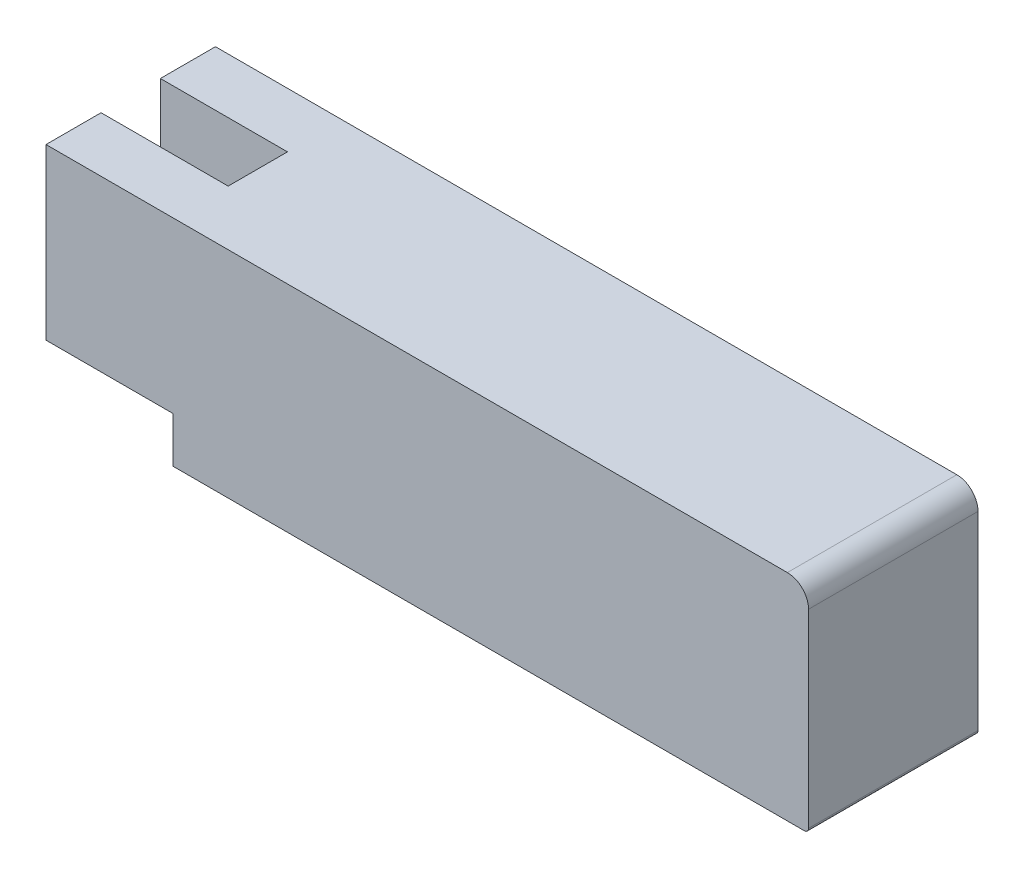
ISO-10303-21;
HEADER;
FILE_DESCRIPTION(('STEP AP214'),'2;1');
FILE_NAME('part.step','',(''),(''),'','','');
FILE_SCHEMA(('AUTOMOTIVE_DESIGN { 1 0 10303 214 1 1 1 1 }'));
ENDSEC;
DATA;
#1=APPLICATION_CONTEXT('core data for automotive mechanical design processes');
#2=APPLICATION_PROTOCOL_DEFINITION('international standard','automotive_design',2000,#1);
#3=PRODUCT_CONTEXT('',#1,'mechanical');
#4=PRODUCT('Part','Part','',(#3));
#5=PRODUCT_RELATED_PRODUCT_CATEGORY('part','',(#4));
#6=PRODUCT_DEFINITION_FORMATION('','',#4);
#7=PRODUCT_DEFINITION_CONTEXT('part definition',#1,'design');
#8=PRODUCT_DEFINITION('design','',#6,#7);
#9=PRODUCT_DEFINITION_SHAPE('','',#8);
#10=(LENGTH_UNIT() NAMED_UNIT(*) SI_UNIT(.MILLI.,.METRE.));
#11=(NAMED_UNIT(*) PLANE_ANGLE_UNIT() SI_UNIT($,.RADIAN.));
#12=(NAMED_UNIT(*) SI_UNIT($,.STERADIAN.) SOLID_ANGLE_UNIT());
#13=UNCERTAINTY_MEASURE_WITH_UNIT(LENGTH_MEASURE(1.E-05),#10,'distance_accuracy_value','');
#14=(GEOMETRIC_REPRESENTATION_CONTEXT(3) GLOBAL_UNCERTAINTY_ASSIGNED_CONTEXT((#13)) GLOBAL_UNIT_ASSIGNED_CONTEXT((#10,
#11,#12)) REPRESENTATION_CONTEXT('',''));
#15=CARTESIAN_POINT('',(0.,0.,0.));
#16=DIRECTION('',(0.,0.,1.));
#17=DIRECTION('',(1.,0.,0.));
#18=AXIS2_PLACEMENT_3D('',#15,#16,#17);
#19=CARTESIAN_POINT('',(0.,0.,20.));
#20=DIRECTION('',(1.,0.,0.));
#21=DIRECTION('',(0.,1.,0.));
#22=AXIS2_PLACEMENT_3D('',#19,#20,#21);
#23=PLANE('',#22);
#24=DIRECTION('',(0.,-1.,0.));
#25=VECTOR('',#24,1.);
#26=CARTESIAN_POINT('',(0.,0.,-7.));
#27=LINE('',#26,#25);
#28=CARTESIAN_POINT('',(0.,0.,-7.));
#29=VERTEX_POINT('',#28);
#30=CARTESIAN_POINT('',(0.,-40.,-7.));
#31=VERTEX_POINT('',#30);
#32=EDGE_CURVE('E122',#29,#31,#27,.T.);
#33=ORIENTED_EDGE('',*,*,#32,.F.);
#34=DIRECTION('',(0.,0.,-1.));
#35=VECTOR('',#34,1.);
#36=CARTESIAN_POINT('',(0.,0.,20.));
#37=LINE('',#36,#35);
#38=CARTESIAN_POINT('',(0.,0.,-20.));
#39=VERTEX_POINT('',#38);
#40=EDGE_CURVE('E191',#29,#39,#37,.T.);
#41=ORIENTED_EDGE('',*,*,#40,.T.);
#42=DIRECTION('',(0.,-1.,0.));
#43=VECTOR('',#42,1.);
#44=CARTESIAN_POINT('',(0.,0.,-20.));
#45=LINE('',#44,#43);
#46=CARTESIAN_POINT('',(0.,-40.,-20.));
#47=VERTEX_POINT('',#46);
#48=EDGE_CURVE('E145',#39,#47,#45,.T.);
#49=ORIENTED_EDGE('',*,*,#48,.T.);
#50=DIRECTION('',(0.,0.,-1.));
#51=VECTOR('',#50,1.);
#52=CARTESIAN_POINT('',(0.,-40.,20.));
#53=LINE('',#52,#51);
#54=EDGE_CURVE('E138',#31,#47,#53,.T.);
#55=ORIENTED_EDGE('',*,*,#54,.F.);
#56=EDGE_LOOP('',(#33,#41,#49,#55));
#57=FACE_BOUND('',#56,.T.);
#58=ADVANCED_FACE('F33',(#57),#23,.F.);
#59=CARTESIAN_POINT('',(0.,-40.,20.));
#60=DIRECTION('',(0.,1.,0.));
#61=DIRECTION('',(0.,0.,1.));
#62=AXIS2_PLACEMENT_3D('',#59,#60,#61);
#63=PLANE('',#62);
#64=DIRECTION('',(1.,0.,0.));
#65=VECTOR('',#64,1.);
#66=CARTESIAN_POINT('',(0.,-40.,-7.));
#67=LINE('',#66,#65);
#68=CARTESIAN_POINT('',(30.,-40.,-7.));
#69=VERTEX_POINT('',#68);
#70=EDGE_CURVE('E126',#31,#69,#67,.T.);
#71=ORIENTED_EDGE('',*,*,#70,.F.);
#72=ORIENTED_EDGE('',*,*,#54,.T.);
#73=DIRECTION('',(1.,0.,0.));
#74=VECTOR('',#73,1.);
#75=CARTESIAN_POINT('',(0.,-40.,-20.));
#76=LINE('',#75,#74);
#77=CARTESIAN_POINT('',(30.,-40.,-20.));
#78=VERTEX_POINT('',#77);
#79=EDGE_CURVE('E197',#47,#78,#76,.T.);
#80=ORIENTED_EDGE('',*,*,#79,.T.);
#81=DIRECTION('',(0.,0.,-1.));
#82=VECTOR('',#81,1.);
#83=CARTESIAN_POINT('',(30.,-40.,20.));
#84=LINE('',#83,#82);
#85=EDGE_CURVE('E140',#69,#78,#84,.T.);
#86=ORIENTED_EDGE('',*,*,#85,.F.);
#87=EDGE_LOOP('',(#71,#72,#80,#86));
#88=FACE_BOUND('',#87,.T.);
#89=ADVANCED_FACE('F136',(#88),#63,.F.);
#90=CARTESIAN_POINT('',(0.,0.,20.));
#91=DIRECTION('',(0.,1.,0.));
#92=DIRECTION('',(0.,0.,1.));
#93=AXIS2_PLACEMENT_3D('',#90,#91,#92);
#94=PLANE('',#93);
#95=DIRECTION('',(1.,0.,0.));
#96=VECTOR('',#95,1.);
#97=CARTESIAN_POINT('',(0.,0.,20.));
#98=LINE('',#97,#96);
#99=CARTESIAN_POINT('',(0.,0.,20.));
#100=VERTEX_POINT('',#99);
#101=CARTESIAN_POINT('',(175.,0.,20.));
#102=VERTEX_POINT('',#101);
#103=EDGE_CURVE('E202',#100,#102,#98,.T.);
#104=ORIENTED_EDGE('',*,*,#103,.T.);
#105=DIRECTION('',(0.,0.,-1.));
#106=VECTOR('',#105,1.);
#107=CARTESIAN_POINT('',(175.,0.,20.));
#108=LINE('',#107,#106);
#109=CARTESIAN_POINT('',(175.,0.,-20.));
#110=VERTEX_POINT('',#109);
#111=EDGE_CURVE('E150',#102,#110,#108,.T.);
#112=ORIENTED_EDGE('',*,*,#111,.T.);
#113=DIRECTION('',(1.,0.,0.));
#114=VECTOR('',#113,1.);
#115=CARTESIAN_POINT('',(0.,0.,-20.));
#116=LINE('',#115,#114);
#117=EDGE_CURVE('E179',#39,#110,#116,.T.);
#118=ORIENTED_EDGE('',*,*,#117,.F.);
#119=ORIENTED_EDGE('',*,*,#40,.F.);
#120=DIRECTION('',(-1.,0.,0.));
#121=VECTOR('',#120,1.);
#122=CARTESIAN_POINT('',(0.,0.,-7.));
#123=LINE('',#122,#121);
#124=CARTESIAN_POINT('',(30.,0.,-7.));
#125=VERTEX_POINT('',#124);
#126=EDGE_CURVE('E129',#125,#29,#123,.T.);
#127=ORIENTED_EDGE('',*,*,#126,.F.);
#128=DIRECTION('',(0.,0.,1.));
#129=VECTOR('',#128,1.);
#130=CARTESIAN_POINT('',(30.,0.,-7.));
#131=LINE('',#130,#129);
#132=CARTESIAN_POINT('',(30.,0.,7.));
#133=VERTEX_POINT('',#132);
#134=EDGE_CURVE('E201',#125,#133,#131,.T.);
#135=ORIENTED_EDGE('',*,*,#134,.T.);
#136=DIRECTION('',(-1.,0.,0.));
#137=VECTOR('',#136,1.);
#138=CARTESIAN_POINT('',(0.,0.,7.));
#139=LINE('',#138,#137);
#140=CARTESIAN_POINT('',(0.,0.,7.));
#141=VERTEX_POINT('',#140);
#142=EDGE_CURVE('E133',#133,#141,#139,.T.);
#143=ORIENTED_EDGE('',*,*,#142,.T.);
#144=EDGE_CURVE('E188',#100,#141,#37,.T.);
#145=ORIENTED_EDGE('',*,*,#144,.F.);
#146=EDGE_LOOP('',(#104,#112,#118,#119,#127,#135,#143,#145));
#147=FACE_BOUND('',#146,.T.);
#148=ADVANCED_FACE('F228',(#147),#94,.T.);
#149=ORIENTED_EDGE('',*,*,#144,.T.);
#150=DIRECTION('',(0.,-1.,0.));
#151=VECTOR('',#150,1.);
#152=CARTESIAN_POINT('',(0.,0.,7.));
#153=LINE('',#152,#151);
#154=CARTESIAN_POINT('',(0.,-40.,7.));
#155=VERTEX_POINT('',#154);
#156=EDGE_CURVE('E223',#141,#155,#153,.T.);
#157=ORIENTED_EDGE('',*,*,#156,.T.);
#158=CARTESIAN_POINT('',(0.,-40.,20.));
#159=VERTEX_POINT('',#158);
#160=EDGE_CURVE('E146',#159,#155,#53,.T.);
#161=ORIENTED_EDGE('',*,*,#160,.F.);
#162=DIRECTION('',(0.,-1.,0.));
#163=VECTOR('',#162,1.);
#164=CARTESIAN_POINT('',(0.,0.,20.));
#165=LINE('',#164,#163);
#166=EDGE_CURVE('E182',#100,#159,#165,.T.);
#167=ORIENTED_EDGE('',*,*,#166,.F.);
#168=EDGE_LOOP('',(#149,#157,#161,#167));
#169=FACE_BOUND('',#168,.T.);
#170=ADVANCED_FACE('F244',(#169),#23,.F.);
#171=ORIENTED_EDGE('',*,*,#160,.T.);
#172=DIRECTION('',(1.,0.,0.));
#173=VECTOR('',#172,1.);
#174=CARTESIAN_POINT('',(0.,-40.,7.));
#175=LINE('',#174,#173);
#176=CARTESIAN_POINT('',(30.,-40.,7.));
#177=VERTEX_POINT('',#176);
#178=EDGE_CURVE('E220',#155,#177,#175,.T.);
#179=ORIENTED_EDGE('',*,*,#178,.T.);
#180=CARTESIAN_POINT('',(30.,-40.,20.));
#181=VERTEX_POINT('',#180);
#182=EDGE_CURVE('E147',#181,#177,#84,.T.);
#183=ORIENTED_EDGE('',*,*,#182,.F.);
#184=DIRECTION('',(1.,0.,0.));
#185=VECTOR('',#184,1.);
#186=CARTESIAN_POINT('',(0.,-40.,20.));
#187=LINE('',#186,#185);
#188=EDGE_CURVE('E210',#159,#181,#187,.T.);
#189=ORIENTED_EDGE('',*,*,#188,.F.);
#190=EDGE_LOOP('',(#171,#179,#183,#189));
#191=FACE_BOUND('',#190,.T.);
#192=ADVANCED_FACE('F249',(#191),#63,.F.);
#193=CARTESIAN_POINT('',(30.,-40.,20.));
#194=DIRECTION('',(1.,0.,0.));
#195=DIRECTION('',(0.,0.,-1.));
#196=AXIS2_PLACEMENT_3D('',#193,#194,#195);
#197=PLANE('',#196);
#198=DIRECTION('',(0.,-1.,0.));
#199=VECTOR('',#198,1.);
#200=CARTESIAN_POINT('',(30.,-40.,-20.));
#201=LINE('',#200,#199);
#202=CARTESIAN_POINT('',(30.,-50.78,-20.));
#203=VERTEX_POINT('',#202);
#204=EDGE_CURVE('E184',#78,#203,#201,.T.);
#205=ORIENTED_EDGE('',*,*,#204,.T.);
#206=DIRECTION('',(0.,0.,-1.));
#207=VECTOR('',#206,1.);
#208=CARTESIAN_POINT('',(30.,-50.78,20.));
#209=LINE('',#208,#207);
#210=CARTESIAN_POINT('',(30.,-50.78,20.));
#211=VERTEX_POINT('',#210);
#212=EDGE_CURVE('E190',#211,#203,#209,.T.);
#213=ORIENTED_EDGE('',*,*,#212,.F.);
#214=DIRECTION('',(0.,-1.,0.));
#215=VECTOR('',#214,1.);
#216=CARTESIAN_POINT('',(30.,-40.,20.));
#217=LINE('',#216,#215);
#218=EDGE_CURVE('E208',#181,#211,#217,.T.);
#219=ORIENTED_EDGE('',*,*,#218,.F.);
#220=ORIENTED_EDGE('',*,*,#182,.T.);
#221=DIRECTION('',(0.,1.,0.));
#222=VECTOR('',#221,1.);
#223=CARTESIAN_POINT('',(30.,0.,7.));
#224=LINE('',#223,#222);
#225=EDGE_CURVE('E218',#177,#133,#224,.T.);
#226=ORIENTED_EDGE('',*,*,#225,.T.);
#227=ORIENTED_EDGE('',*,*,#134,.F.);
#228=DIRECTION('',(0.,1.,0.));
#229=VECTOR('',#228,1.);
#230=CARTESIAN_POINT('',(30.,0.,-7.));
#231=LINE('',#230,#229);
#232=EDGE_CURVE('E141',#69,#125,#231,.T.);
#233=ORIENTED_EDGE('',*,*,#232,.F.);
#234=ORIENTED_EDGE('',*,*,#85,.T.);
#235=EDGE_LOOP('',(#205,#213,#219,#220,#226,#227,#233,#234));
#236=FACE_BOUND('',#235,.T.);
#237=ADVANCED_FACE('F195',(#236),#197,.F.);
#238=CARTESIAN_POINT('',(30.,-50.78,20.));
#239=DIRECTION('',(0.,1.,0.));
#240=DIRECTION('',(0.,0.,1.));
#241=AXIS2_PLACEMENT_3D('',#238,#239,#240);
#242=PLANE('',#241);
#243=DIRECTION('',(1.,0.,0.));
#244=VECTOR('',#243,1.);
#245=CARTESIAN_POINT('',(30.,-50.78,-20.));
#246=LINE('',#245,#244);
#247=CARTESIAN_POINT('',(179.,-50.78,-20.));
#248=VERTEX_POINT('',#247);
#249=EDGE_CURVE('E180',#203,#248,#246,.T.);
#250=ORIENTED_EDGE('',*,*,#249,.T.);
#251=DIRECTION('',(0.,0.,-1.));
#252=VECTOR('',#251,1.);
#253=CARTESIAN_POINT('',(179.,-50.78,20.));
#254=LINE('',#253,#252);
#255=CARTESIAN_POINT('',(179.,-50.78,20.));
#256=VERTEX_POINT('',#255);
#257=EDGE_CURVE('E41',#248,#256,#254,.F.);
#258=ORIENTED_EDGE('',*,*,#257,.T.);
#259=DIRECTION('',(1.,0.,0.));
#260=VECTOR('',#259,1.);
#261=CARTESIAN_POINT('',(30.,-50.78,20.));
#262=LINE('',#261,#260);
#263=EDGE_CURVE('E206',#211,#256,#262,.T.);
#264=ORIENTED_EDGE('',*,*,#263,.F.);
#265=ORIENTED_EDGE('',*,*,#212,.T.);
#266=EDGE_LOOP('',(#250,#258,#264,#265));
#267=FACE_BOUND('',#266,.T.);
#268=ADVANCED_FACE('F264',(#267),#242,.F.);
#269=CARTESIAN_POINT('',(180.,0.,20.));
#270=DIRECTION('',(1.,0.,0.));
#271=DIRECTION('',(0.,0.,-1.));
#272=AXIS2_PLACEMENT_3D('',#269,#270,#271);
#273=PLANE('',#272);
#274=DIRECTION('',(0.,-1.,0.));
#275=VECTOR('',#274,1.);
#276=CARTESIAN_POINT('',(180.,0.,20.));
#277=LINE('',#276,#275);
#278=CARTESIAN_POINT('',(180.,-5.,20.));
#279=VERTEX_POINT('',#278);
#280=CARTESIAN_POINT('',(180.,-49.78,20.));
#281=VERTEX_POINT('',#280);
#282=EDGE_CURVE('E174',#279,#281,#277,.T.);
#283=ORIENTED_EDGE('',*,*,#282,.T.);
#284=DIRECTION('',(0.,0.,-1.));
#285=VECTOR('',#284,1.);
#286=CARTESIAN_POINT('',(180.,-49.78,-20.));
#287=LINE('',#286,#285);
#288=CARTESIAN_POINT('',(180.,-49.78,-20.));
#289=VERTEX_POINT('',#288);
#290=EDGE_CURVE('E163',#281,#289,#287,.T.);
#291=ORIENTED_EDGE('',*,*,#290,.T.);
#292=DIRECTION('',(0.,-1.,0.));
#293=VECTOR('',#292,1.);
#294=CARTESIAN_POINT('',(180.,0.,-20.));
#295=LINE('',#294,#293);
#296=CARTESIAN_POINT('',(180.,-5.,-20.));
#297=VERTEX_POINT('',#296);
#298=EDGE_CURVE('E171',#297,#289,#295,.T.);
#299=ORIENTED_EDGE('',*,*,#298,.F.);
#300=DIRECTION('',(0.,0.,-1.));
#301=VECTOR('',#300,1.);
#302=CARTESIAN_POINT('',(180.,-5.,20.));
#303=LINE('',#302,#301);
#304=EDGE_CURVE('E159',#297,#279,#303,.F.);
#305=ORIENTED_EDGE('',*,*,#304,.T.);
#306=EDGE_LOOP('',(#283,#291,#299,#305));
#307=FACE_BOUND('',#306,.T.);
#308=ADVANCED_FACE('F170',(#307),#273,.T.);
#309=CARTESIAN_POINT('',(0.,0.,20.));
#310=DIRECTION('',(0.,0.,1.));
#311=DIRECTION('',(1.,0.,0.));
#312=AXIS2_PLACEMENT_3D('',#309,#310,#311);
#313=PLANE('',#312);
#314=ORIENTED_EDGE('',*,*,#263,.T.);
#315=CARTESIAN_POINT('',(179.,-49.78,20.));
#316=DIRECTION('',(0.,0.,1.));
#317=DIRECTION('',(1.,0.,0.));
#318=AXIS2_PLACEMENT_3D('',#315,#316,#317);
#319=CIRCLE('',#318,1.);
#320=EDGE_CURVE('E11',#256,#281,#319,.T.);
#321=ORIENTED_EDGE('',*,*,#320,.T.);
#322=ORIENTED_EDGE('',*,*,#282,.F.);
#323=CARTESIAN_POINT('',(175.,-5.,20.));
#324=DIRECTION('',(0.,0.,1.));
#325=DIRECTION('',(1.,0.,0.));
#326=AXIS2_PLACEMENT_3D('',#323,#324,#325);
#327=CIRCLE('',#326,5.);
#328=EDGE_CURVE('E161',#279,#102,#327,.T.);
#329=ORIENTED_EDGE('',*,*,#328,.T.);
#330=ORIENTED_EDGE('',*,*,#103,.F.);
#331=ORIENTED_EDGE('',*,*,#166,.T.);
#332=ORIENTED_EDGE('',*,*,#188,.T.);
#333=ORIENTED_EDGE('',*,*,#218,.T.);
#334=EDGE_LOOP('',(#314,#321,#322,#329,#330,#331,#332,#333));
#335=FACE_BOUND('',#334,.T.);
#336=ADVANCED_FACE('F236',(#335),#313,.T.);
#337=CARTESIAN_POINT('',(0.,0.,-20.));
#338=DIRECTION('',(0.,0.,1.));
#339=DIRECTION('',(1.,0.,0.));
#340=AXIS2_PLACEMENT_3D('',#337,#338,#339);
#341=PLANE('',#340);
#342=ORIENTED_EDGE('',*,*,#298,.T.);
#343=CARTESIAN_POINT('',(179.,-49.78,-20.));
#344=DIRECTION('',(0.,0.,1.));
#345=DIRECTION('',(1.,0.,0.));
#346=AXIS2_PLACEMENT_3D('',#343,#344,#345);
#347=CIRCLE('',#346,1.);
#348=EDGE_CURVE('E55',#289,#248,#347,.F.);
#349=ORIENTED_EDGE('',*,*,#348,.T.);
#350=ORIENTED_EDGE('',*,*,#249,.F.);
#351=ORIENTED_EDGE('',*,*,#204,.F.);
#352=ORIENTED_EDGE('',*,*,#79,.F.);
#353=ORIENTED_EDGE('',*,*,#48,.F.);
#354=ORIENTED_EDGE('',*,*,#117,.T.);
#355=CARTESIAN_POINT('',(175.,-5.,-20.));
#356=DIRECTION('',(0.,0.,1.));
#357=DIRECTION('',(1.,0.,0.));
#358=AXIS2_PLACEMENT_3D('',#355,#356,#357);
#359=CIRCLE('',#358,5.);
#360=EDGE_CURVE('E157',#110,#297,#359,.F.);
#361=ORIENTED_EDGE('',*,*,#360,.T.);
#362=EDGE_LOOP('',(#342,#349,#350,#351,#352,#353,#354,#361));
#363=FACE_BOUND('',#362,.T.);
#364=ADVANCED_FACE('F177',(#363),#341,.F.);
#365=CARTESIAN_POINT('',(0.,0.,-7.));
#366=DIRECTION('',(0.,0.,1.));
#367=DIRECTION('',(1.,0.,0.));
#368=AXIS2_PLACEMENT_3D('',#365,#366,#367);
#369=PLANE('',#368);
#370=ORIENTED_EDGE('',*,*,#32,.T.);
#371=ORIENTED_EDGE('',*,*,#70,.T.);
#372=ORIENTED_EDGE('',*,*,#232,.T.);
#373=ORIENTED_EDGE('',*,*,#126,.T.);
#374=EDGE_LOOP('',(#370,#371,#372,#373));
#375=FACE_BOUND('',#374,.T.);
#376=ADVANCED_FACE('F124',(#375),#369,.T.);
#377=CARTESIAN_POINT('',(0.,0.,7.));
#378=DIRECTION('',(0.,0.,1.));
#379=DIRECTION('',(1.,0.,0.));
#380=AXIS2_PLACEMENT_3D('',#377,#378,#379);
#381=PLANE('',#380);
#382=ORIENTED_EDGE('',*,*,#156,.F.);
#383=ORIENTED_EDGE('',*,*,#142,.F.);
#384=ORIENTED_EDGE('',*,*,#225,.F.);
#385=ORIENTED_EDGE('',*,*,#178,.F.);
#386=EDGE_LOOP('',(#382,#383,#384,#385));
#387=FACE_BOUND('',#386,.T.);
#388=ADVANCED_FACE('F241',(#387),#381,.F.);
#389=CARTESIAN_POINT('',(175.,-5.,20.));
#390=DIRECTION('',(0.,0.,-1.));
#391=DIRECTION('',(-1.,0.,0.));
#392=AXIS2_PLACEMENT_3D('',#389,#390,#391);
#393=CYLINDRICAL_SURFACE('',#392,5.);
#394=ORIENTED_EDGE('',*,*,#328,.F.);
#395=ORIENTED_EDGE('',*,*,#304,.F.);
#396=ORIENTED_EDGE('',*,*,#360,.F.);
#397=ORIENTED_EDGE('',*,*,#111,.F.);
#398=EDGE_LOOP('',(#394,#395,#396,#397));
#399=FACE_BOUND('',#398,.T.);
#400=ADVANCED_FACE('F234',(#399),#393,.T.);
#401=CARTESIAN_POINT('',(179.,-49.78,20.));
#402=DIRECTION('',(0.,0.,1.));
#403=DIRECTION('',(1.,0.,0.));
#404=AXIS2_PLACEMENT_3D('',#401,#402,#403);
#405=CYLINDRICAL_SURFACE('',#404,1.);
#406=ORIENTED_EDGE('',*,*,#320,.F.);
#407=ORIENTED_EDGE('',*,*,#257,.F.);
#408=ORIENTED_EDGE('',*,*,#348,.F.);
#409=ORIENTED_EDGE('',*,*,#290,.F.);
#410=EDGE_LOOP('',(#406,#407,#408,#409));
#411=FACE_BOUND('',#410,.T.);
#412=ADVANCED_FACE('F35',(#411),#405,.T.);
#413=CLOSED_SHELL('',(#58,#89,#148,#170,#192,#237,#268,#308,#336,#364,#376,#388,#400,#412));
#414=MANIFOLD_SOLID_BREP('B2',#413);
#415=ADVANCED_BREP_SHAPE_REPRESENTATION('',(#18,#414),#14);
#416=SHAPE_DEFINITION_REPRESENTATION(#9,#415);
ENDSEC;
END-ISO-10303-21;
